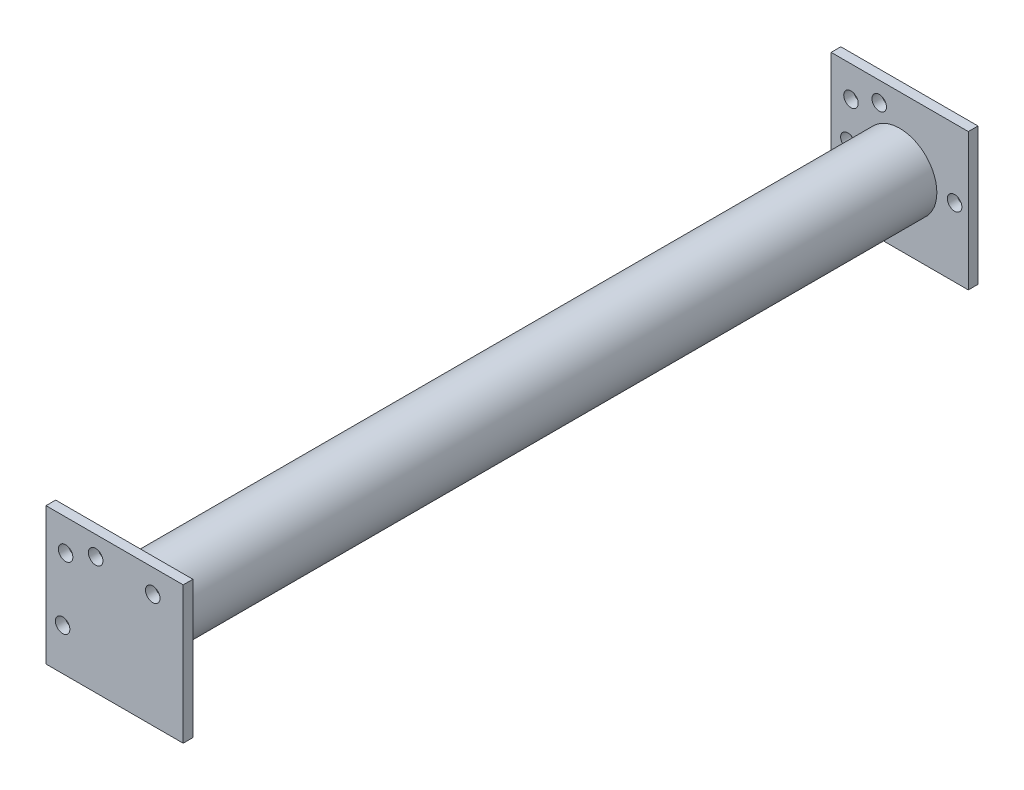
ISO-10303-21;
HEADER;
FILE_DESCRIPTION(('STEP AP214'),'2;1');
FILE_NAME('part.step','',(''),(''),'','','');
FILE_SCHEMA(('AUTOMOTIVE_DESIGN { 1 0 10303 214 1 1 1 1 }'));
ENDSEC;
DATA;
#1=APPLICATION_CONTEXT('core data for automotive mechanical design processes');
#2=APPLICATION_PROTOCOL_DEFINITION('international standard','automotive_design',2000,#1);
#3=PRODUCT_CONTEXT('',#1,'mechanical');
#4=PRODUCT('Part','Part','',(#3));
#5=PRODUCT_RELATED_PRODUCT_CATEGORY('part','',(#4));
#6=PRODUCT_DEFINITION_FORMATION('','',#4);
#7=PRODUCT_DEFINITION_CONTEXT('part definition',#1,'design');
#8=PRODUCT_DEFINITION('design','',#6,#7);
#9=PRODUCT_DEFINITION_SHAPE('','',#8);
#10=(LENGTH_UNIT() NAMED_UNIT(*) SI_UNIT(.MILLI.,.METRE.));
#11=(NAMED_UNIT(*) PLANE_ANGLE_UNIT() SI_UNIT($,.RADIAN.));
#12=(NAMED_UNIT(*) SI_UNIT($,.STERADIAN.) SOLID_ANGLE_UNIT());
#13=UNCERTAINTY_MEASURE_WITH_UNIT(LENGTH_MEASURE(1.E-05),#10,'distance_accuracy_value','');
#14=(GEOMETRIC_REPRESENTATION_CONTEXT(3) GLOBAL_UNCERTAINTY_ASSIGNED_CONTEXT((#13)) GLOBAL_UNIT_ASSIGNED_CONTEXT((#10,
#11,#12)) REPRESENTATION_CONTEXT('',''));
#15=CARTESIAN_POINT('',(0.,0.,0.));
#16=DIRECTION('',(0.,0.,1.));
#17=DIRECTION('',(1.,0.,0.));
#18=AXIS2_PLACEMENT_3D('',#15,#16,#17);
#19=CARTESIAN_POINT('',(0.,0.,961.));
#20=DIRECTION('',(0.,0.,-1.));
#21=DIRECTION('',(-1.,0.,0.));
#22=AXIS2_PLACEMENT_3D('',#19,#20,#21);
#23=CYLINDRICAL_SURFACE('',#22,46.);
#24=CARTESIAN_POINT('',(0.,0.,961.));
#25=DIRECTION('',(0.,0.,1.));
#26=DIRECTION('',(1.,0.,0.));
#27=AXIS2_PLACEMENT_3D('',#24,#25,#26);
#28=CIRCLE('',#27,46.);
#29=CARTESIAN_POINT('',(46.,0.,961.));
#30=VERTEX_POINT('',#29);
#31=EDGE_CURVE('E11',#30,#30,#28,.T.);
#32=ORIENTED_EDGE('',*,*,#31,.F.);
#33=EDGE_LOOP('',(#32));
#34=FACE_BOUND('',#33,.T.);
#35=CARTESIAN_POINT('',(0.,0.,0.));
#36=DIRECTION('',(0.,0.,1.));
#37=DIRECTION('',(1.,0.,0.));
#38=AXIS2_PLACEMENT_3D('',#35,#36,#37);
#39=CIRCLE('',#38,46.);
#40=CARTESIAN_POINT('',(46.,0.,0.));
#41=VERTEX_POINT('',#40);
#42=EDGE_CURVE('E45',#41,#41,#39,.T.);
#43=ORIENTED_EDGE('',*,*,#42,.T.);
#44=EDGE_LOOP('',(#43));
#45=FACE_BOUND('',#44,.T.);
#46=ADVANCED_FACE('F42',(#34,#45),#23,.T.);
#47=CARTESIAN_POINT('',(0.,0.,-12.));
#48=DIRECTION('',(0.,0.,-1.));
#49=DIRECTION('',(-1.,0.,0.));
#50=AXIS2_PLACEMENT_3D('',#47,#48,#49);
#51=PLANE('',#50);
#52=CARTESIAN_POINT('',(-60.4079697971354,46.8966168188544,-12.));
#53=DIRECTION('',(0.,0.,-1.));
#54=DIRECTION('',(-1.,0.,0.));
#55=AXIS2_PLACEMENT_3D('',#52,#53,#54);
#56=CIRCLE('',#55,9.);
#57=CARTESIAN_POINT('',(-69.4079697971354,46.8966168188544,-12.));
#58=VERTEX_POINT('',#57);
#59=EDGE_CURVE('E160',#58,#58,#56,.T.);
#60=ORIENTED_EDGE('',*,*,#59,.F.);
#61=EDGE_LOOP('',(#60));
#62=FACE_BOUND('',#61,.T.);
#63=CARTESIAN_POINT('',(-64.2275891692642,0.,-12.));
#64=DIRECTION('',(0.,0.,-1.));
#65=DIRECTION('',(-1.,0.,0.));
#66=AXIS2_PLACEMENT_3D('',#63,#64,#65);
#67=CIRCLE('',#66,9.);
#68=CARTESIAN_POINT('',(-73.2275891692642,0.,-12.));
#69=VERTEX_POINT('',#68);
#70=EDGE_CURVE('E172',#69,#69,#67,.T.);
#71=ORIENTED_EDGE('',*,*,#70,.F.);
#72=EDGE_LOOP('',(#71));
#73=FACE_BOUND('',#72,.T.);
#74=DIRECTION('',(0.,-1.,0.));
#75=VECTOR('',#74,1.);
#76=CARTESIAN_POINT('',(85.,85.,-12.));
#77=LINE('',#76,#75);
#78=CARTESIAN_POINT('',(85.,85.,-12.));
#79=VERTEX_POINT('',#78);
#80=CARTESIAN_POINT('',(85.,-85.,-12.));
#81=VERTEX_POINT('',#80);
#82=EDGE_CURVE('E178',#79,#81,#77,.T.);
#83=ORIENTED_EDGE('',*,*,#82,.T.);
#84=DIRECTION('',(-1.,0.,0.));
#85=VECTOR('',#84,1.);
#86=CARTESIAN_POINT('',(85.,-85.,-12.));
#87=LINE('',#86,#85);
#88=CARTESIAN_POINT('',(-85.,-85.,-12.));
#89=VERTEX_POINT('',#88);
#90=EDGE_CURVE('E92',#81,#89,#87,.T.);
#91=ORIENTED_EDGE('',*,*,#90,.T.);
#92=DIRECTION('',(0.,1.,0.));
#93=VECTOR('',#92,1.);
#94=CARTESIAN_POINT('',(-85.,85.,-12.));
#95=LINE('',#94,#93);
#96=CARTESIAN_POINT('',(-85.,85.,-12.));
#97=VERTEX_POINT('',#96);
#98=EDGE_CURVE('E181',#89,#97,#95,.T.);
#99=ORIENTED_EDGE('',*,*,#98,.T.);
#100=DIRECTION('',(1.,0.,0.));
#101=VECTOR('',#100,1.);
#102=CARTESIAN_POINT('',(85.,85.,-12.));
#103=LINE('',#102,#101);
#104=EDGE_CURVE('E60',#97,#79,#103,.T.);
#105=ORIENTED_EDGE('',*,*,#104,.T.);
#106=EDGE_LOOP('',(#83,#91,#99,#105));
#107=FACE_BOUND('',#106,.T.);
#108=CARTESIAN_POINT('',(68.0305385279705,0.,-12.));
#109=DIRECTION('',(0.,0.,-1.));
#110=DIRECTION('',(-1.,0.,0.));
#111=AXIS2_PLACEMENT_3D('',#108,#109,#110);
#112=CIRCLE('',#111,9.);
#113=CARTESIAN_POINT('',(59.0305385279705,0.,-12.));
#114=VERTEX_POINT('',#113);
#115=EDGE_CURVE('E166',#114,#114,#112,.T.);
#116=ORIENTED_EDGE('',*,*,#115,.F.);
#117=EDGE_LOOP('',(#116));
#118=FACE_BOUND('',#117,.T.);
#119=CARTESIAN_POINT('',(-25.4168158132703,60.6636282223423,-12.));
#120=DIRECTION('',(0.,0.,-1.));
#121=DIRECTION('',(-1.,0.,0.));
#122=AXIS2_PLACEMENT_3D('',#119,#120,#121);
#123=CIRCLE('',#122,9.);
#124=CARTESIAN_POINT('',(-34.4168158132703,60.6636282223423,-12.));
#125=VERTEX_POINT('',#124);
#126=EDGE_CURVE('E154',#125,#125,#123,.T.);
#127=ORIENTED_EDGE('',*,*,#126,.F.);
#128=EDGE_LOOP('',(#127));
#129=FACE_BOUND('',#128,.T.);
#130=ADVANCED_FACE('F209',(#62,#73,#107,#118,#129),#51,.T.);
#131=CARTESIAN_POINT('',(0.,0.,0.));
#132=DIRECTION('',(0.,0.,-1.));
#133=DIRECTION('',(-1.,0.,0.));
#134=AXIS2_PLACEMENT_3D('',#131,#132,#133);
#135=PLANE('',#134);
#136=ORIENTED_EDGE('',*,*,#42,.F.);
#137=EDGE_LOOP('',(#136));
#138=FACE_BOUND('',#137,.T.);
#139=DIRECTION('',(0.,-1.,0.));
#140=VECTOR('',#139,1.);
#141=CARTESIAN_POINT('',(85.,85.,0.));
#142=LINE('',#141,#140);
#143=CARTESIAN_POINT('',(85.,85.,0.));
#144=VERTEX_POINT('',#143);
#145=CARTESIAN_POINT('',(85.,-85.,0.));
#146=VERTEX_POINT('',#145);
#147=EDGE_CURVE('E175',#144,#146,#142,.T.);
#148=ORIENTED_EDGE('',*,*,#147,.F.);
#149=DIRECTION('',(1.,0.,0.));
#150=VECTOR('',#149,1.);
#151=CARTESIAN_POINT('',(85.,85.,0.));
#152=LINE('',#151,#150);
#153=CARTESIAN_POINT('',(-85.,85.,0.));
#154=VERTEX_POINT('',#153);
#155=EDGE_CURVE('E84',#154,#144,#152,.T.);
#156=ORIENTED_EDGE('',*,*,#155,.F.);
#157=DIRECTION('',(0.,1.,0.));
#158=VECTOR('',#157,1.);
#159=CARTESIAN_POINT('',(-85.,85.,0.));
#160=LINE('',#159,#158);
#161=CARTESIAN_POINT('',(-85.,-85.,0.));
#162=VERTEX_POINT('',#161);
#163=EDGE_CURVE('E78',#162,#154,#160,.T.);
#164=ORIENTED_EDGE('',*,*,#163,.F.);
#165=DIRECTION('',(-1.,0.,0.));
#166=VECTOR('',#165,1.);
#167=CARTESIAN_POINT('',(85.,-85.,0.));
#168=LINE('',#167,#166);
#169=EDGE_CURVE('E187',#146,#162,#168,.T.);
#170=ORIENTED_EDGE('',*,*,#169,.F.);
#171=EDGE_LOOP('',(#148,#156,#164,#170));
#172=FACE_BOUND('',#171,.T.);
#173=CARTESIAN_POINT('',(-64.2275891692642,0.,0.));
#174=DIRECTION('',(0.,0.,-1.));
#175=DIRECTION('',(-1.,0.,0.));
#176=AXIS2_PLACEMENT_3D('',#173,#174,#175);
#177=CIRCLE('',#176,9.);
#178=CARTESIAN_POINT('',(-73.2275891692642,0.,0.));
#179=VERTEX_POINT('',#178);
#180=EDGE_CURVE('E169',#179,#179,#177,.T.);
#181=ORIENTED_EDGE('',*,*,#180,.T.);
#182=EDGE_LOOP('',(#181));
#183=FACE_BOUND('',#182,.T.);
#184=CARTESIAN_POINT('',(68.0305385279705,0.,0.));
#185=DIRECTION('',(0.,0.,-1.));
#186=DIRECTION('',(-1.,0.,0.));
#187=AXIS2_PLACEMENT_3D('',#184,#185,#186);
#188=CIRCLE('',#187,9.);
#189=CARTESIAN_POINT('',(59.0305385279705,0.,0.));
#190=VERTEX_POINT('',#189);
#191=EDGE_CURVE('E163',#190,#190,#188,.T.);
#192=ORIENTED_EDGE('',*,*,#191,.T.);
#193=EDGE_LOOP('',(#192));
#194=FACE_BOUND('',#193,.T.);
#195=CARTESIAN_POINT('',(-60.4079697971354,46.8966168188544,0.));
#196=DIRECTION('',(0.,0.,-1.));
#197=DIRECTION('',(-1.,0.,0.));
#198=AXIS2_PLACEMENT_3D('',#195,#196,#197);
#199=CIRCLE('',#198,9.);
#200=CARTESIAN_POINT('',(-69.4079697971354,46.8966168188544,0.));
#201=VERTEX_POINT('',#200);
#202=EDGE_CURVE('E157',#201,#201,#199,.T.);
#203=ORIENTED_EDGE('',*,*,#202,.T.);
#204=EDGE_LOOP('',(#203));
#205=FACE_BOUND('',#204,.T.);
#206=CARTESIAN_POINT('',(-25.4168158132703,60.6636282223423,0.));
#207=DIRECTION('',(0.,0.,-1.));
#208=DIRECTION('',(-1.,0.,0.));
#209=AXIS2_PLACEMENT_3D('',#206,#207,#208);
#210=CIRCLE('',#209,9.);
#211=CARTESIAN_POINT('',(-34.4168158132703,60.6636282223423,0.));
#212=VERTEX_POINT('',#211);
#213=EDGE_CURVE('E148',#212,#212,#210,.T.);
#214=ORIENTED_EDGE('',*,*,#213,.T.);
#215=EDGE_LOOP('',(#214));
#216=FACE_BOUND('',#215,.T.);
#217=ADVANCED_FACE('F205',(#138,#172,#183,#194,#205,#216),#135,.F.);
#218=CARTESIAN_POINT('',(85.,85.,-12.));
#219=DIRECTION('',(-1.,0.,0.));
#220=DIRECTION('',(0.,-1.,0.));
#221=AXIS2_PLACEMENT_3D('',#218,#219,#220);
#222=PLANE('',#221);
#223=ORIENTED_EDGE('',*,*,#147,.T.);
#224=DIRECTION('',(0.,0.,1.));
#225=VECTOR('',#224,1.);
#226=CARTESIAN_POINT('',(85.,-85.,-12.));
#227=LINE('',#226,#225);
#228=EDGE_CURVE('E196',#81,#146,#227,.T.);
#229=ORIENTED_EDGE('',*,*,#228,.F.);
#230=ORIENTED_EDGE('',*,*,#82,.F.);
#231=DIRECTION('',(0.,0.,1.));
#232=VECTOR('',#231,1.);
#233=CARTESIAN_POINT('',(85.,85.,-12.));
#234=LINE('',#233,#232);
#235=EDGE_CURVE('E184',#79,#144,#234,.T.);
#236=ORIENTED_EDGE('',*,*,#235,.T.);
#237=EDGE_LOOP('',(#223,#229,#230,#236));
#238=FACE_BOUND('',#237,.T.);
#239=ADVANCED_FACE('F208',(#238),#222,.F.);
#240=CARTESIAN_POINT('',(85.,-85.,-12.));
#241=DIRECTION('',(0.,1.,0.));
#242=DIRECTION('',(-1.,0.,0.));
#243=AXIS2_PLACEMENT_3D('',#240,#241,#242);
#244=PLANE('',#243);
#245=ORIENTED_EDGE('',*,*,#169,.T.);
#246=DIRECTION('',(0.,0.,1.));
#247=VECTOR('',#246,1.);
#248=CARTESIAN_POINT('',(-85.,-85.,-12.));
#249=LINE('',#248,#247);
#250=EDGE_CURVE('E194',#89,#162,#249,.T.);
#251=ORIENTED_EDGE('',*,*,#250,.F.);
#252=ORIENTED_EDGE('',*,*,#90,.F.);
#253=ORIENTED_EDGE('',*,*,#228,.T.);
#254=EDGE_LOOP('',(#245,#251,#252,#253));
#255=FACE_BOUND('',#254,.T.);
#256=ADVANCED_FACE('F424',(#255),#244,.F.);
#257=CARTESIAN_POINT('',(-85.,85.,-12.));
#258=DIRECTION('',(1.,0.,0.));
#259=DIRECTION('',(0.,1.,0.));
#260=AXIS2_PLACEMENT_3D('',#257,#258,#259);
#261=PLANE('',#260);
#262=ORIENTED_EDGE('',*,*,#163,.T.);
#263=DIRECTION('',(0.,0.,1.));
#264=VECTOR('',#263,1.);
#265=CARTESIAN_POINT('',(-85.,85.,-12.));
#266=LINE('',#265,#264);
#267=EDGE_CURVE('E192',#97,#154,#266,.T.);
#268=ORIENTED_EDGE('',*,*,#267,.F.);
#269=ORIENTED_EDGE('',*,*,#98,.F.);
#270=ORIENTED_EDGE('',*,*,#250,.T.);
#271=EDGE_LOOP('',(#262,#268,#269,#270));
#272=FACE_BOUND('',#271,.T.);
#273=ADVANCED_FACE('F435',(#272),#261,.F.);
#274=CARTESIAN_POINT('',(85.,85.,-12.));
#275=DIRECTION('',(0.,-1.,0.));
#276=DIRECTION('',(0.,0.,-1.));
#277=AXIS2_PLACEMENT_3D('',#274,#275,#276);
#278=PLANE('',#277);
#279=ORIENTED_EDGE('',*,*,#155,.T.);
#280=ORIENTED_EDGE('',*,*,#235,.F.);
#281=ORIENTED_EDGE('',*,*,#104,.F.);
#282=ORIENTED_EDGE('',*,*,#267,.T.);
#283=EDGE_LOOP('',(#279,#280,#281,#282));
#284=FACE_BOUND('',#283,.T.);
#285=ADVANCED_FACE('F445',(#284),#278,.F.);
#286=CARTESIAN_POINT('',(-64.2275891692642,0.,-12.));
#287=DIRECTION('',(0.,0.,1.));
#288=DIRECTION('',(1.,0.,0.));
#289=AXIS2_PLACEMENT_3D('',#286,#287,#288);
#290=CYLINDRICAL_SURFACE('',#289,9.);
#291=ORIENTED_EDGE('',*,*,#70,.T.);
#292=EDGE_LOOP('',(#291));
#293=FACE_BOUND('',#292,.T.);
#294=ORIENTED_EDGE('',*,*,#180,.F.);
#295=EDGE_LOOP('',(#294));
#296=FACE_BOUND('',#295,.T.);
#297=ADVANCED_FACE('F455',(#293,#296),#290,.F.);
#298=CARTESIAN_POINT('',(68.0305385279705,0.,-12.));
#299=DIRECTION('',(0.,0.,1.));
#300=DIRECTION('',(1.,0.,0.));
#301=AXIS2_PLACEMENT_3D('',#298,#299,#300);
#302=CYLINDRICAL_SURFACE('',#301,9.);
#303=ORIENTED_EDGE('',*,*,#115,.T.);
#304=EDGE_LOOP('',(#303));
#305=FACE_BOUND('',#304,.T.);
#306=ORIENTED_EDGE('',*,*,#191,.F.);
#307=EDGE_LOOP('',(#306));
#308=FACE_BOUND('',#307,.T.);
#309=ADVANCED_FACE('F234',(#305,#308),#302,.F.);
#310=CARTESIAN_POINT('',(-60.4079697971354,46.8966168188544,-12.));
#311=DIRECTION('',(0.,0.,1.));
#312=DIRECTION('',(1.,0.,0.));
#313=AXIS2_PLACEMENT_3D('',#310,#311,#312);
#314=CYLINDRICAL_SURFACE('',#313,9.);
#315=ORIENTED_EDGE('',*,*,#59,.T.);
#316=EDGE_LOOP('',(#315));
#317=FACE_BOUND('',#316,.T.);
#318=ORIENTED_EDGE('',*,*,#202,.F.);
#319=EDGE_LOOP('',(#318));
#320=FACE_BOUND('',#319,.T.);
#321=ADVANCED_FACE('F224',(#317,#320),#314,.F.);
#322=CARTESIAN_POINT('',(-25.4168158132703,60.6636282223423,-12.));
#323=DIRECTION('',(0.,0.,1.));
#324=DIRECTION('',(1.,0.,0.));
#325=AXIS2_PLACEMENT_3D('',#322,#323,#324);
#326=CYLINDRICAL_SURFACE('',#325,9.);
#327=ORIENTED_EDGE('',*,*,#126,.T.);
#328=EDGE_LOOP('',(#327));
#329=FACE_BOUND('',#328,.T.);
#330=ORIENTED_EDGE('',*,*,#213,.F.);
#331=EDGE_LOOP('',(#330));
#332=FACE_BOUND('',#331,.T.);
#333=ADVANCED_FACE('F222',(#329,#332),#326,.F.);
#334=CARTESIAN_POINT('',(0.,0.,973.));
#335=DIRECTION('',(0.,0.,1.));
#336=DIRECTION('',(1.,0.,0.));
#337=AXIS2_PLACEMENT_3D('',#334,#335,#336);
#338=PLANE('',#337);
#339=CARTESIAN_POINT('',(-60.7164856170784,46.2261955116715,973.));
#340=DIRECTION('',(0.,0.,1.));
#341=DIRECTION('',(1.,0.,0.));
#342=AXIS2_PLACEMENT_3D('',#339,#340,#341);
#343=CIRCLE('',#342,9.);
#344=CARTESIAN_POINT('',(-51.7164856170784,46.2261955116715,973.));
#345=VERTEX_POINT('',#344);
#346=EDGE_CURVE('E274',#345,#345,#343,.T.);
#347=ORIENTED_EDGE('',*,*,#346,.F.);
#348=EDGE_LOOP('',(#347));
#349=FACE_BOUND('',#348,.T.);
#350=CARTESIAN_POINT('',(47.3067096525702,56.0603134071838,973.));
#351=DIRECTION('',(0.,0.,1.));
#352=DIRECTION('',(1.,0.,0.));
#353=AXIS2_PLACEMENT_3D('',#350,#351,#352);
#354=CIRCLE('',#353,9.);
#355=CARTESIAN_POINT('',(56.3067096525702,56.0603134071838,973.));
#356=VERTEX_POINT('',#355);
#357=EDGE_CURVE('E282',#356,#356,#354,.T.);
#358=ORIENTED_EDGE('',*,*,#357,.F.);
#359=EDGE_LOOP('',(#358));
#360=FACE_BOUND('',#359,.T.);
#361=DIRECTION('',(0.,-1.,0.));
#362=VECTOR('',#361,1.);
#363=CARTESIAN_POINT('',(-85.,85.,973.));
#364=LINE('',#363,#362);
#365=CARTESIAN_POINT('',(-85.,85.,973.));
#366=VERTEX_POINT('',#365);
#367=CARTESIAN_POINT('',(-85.,-85.,973.));
#368=VERTEX_POINT('',#367);
#369=EDGE_CURVE('E130',#366,#368,#364,.T.);
#370=ORIENTED_EDGE('',*,*,#369,.T.);
#371=DIRECTION('',(1.,0.,0.));
#372=VECTOR('',#371,1.);
#373=CARTESIAN_POINT('',(-85.,-85.,973.));
#374=LINE('',#373,#372);
#375=CARTESIAN_POINT('',(85.,-85.,973.));
#376=VERTEX_POINT('',#375);
#377=EDGE_CURVE('E119',#368,#376,#374,.T.);
#378=ORIENTED_EDGE('',*,*,#377,.T.);
#379=DIRECTION('',(0.,1.,0.));
#380=VECTOR('',#379,1.);
#381=CARTESIAN_POINT('',(85.,85.,973.));
#382=LINE('',#381,#380);
#383=CARTESIAN_POINT('',(85.,85.,973.));
#384=VERTEX_POINT('',#383);
#385=EDGE_CURVE('E129',#376,#384,#382,.T.);
#386=ORIENTED_EDGE('',*,*,#385,.T.);
#387=DIRECTION('',(-1.,0.,0.));
#388=VECTOR('',#387,1.);
#389=CARTESIAN_POINT('',(-85.,85.,973.));
#390=LINE('',#389,#388);
#391=EDGE_CURVE('E136',#384,#366,#390,.T.);
#392=ORIENTED_EDGE('',*,*,#391,.T.);
#393=EDGE_LOOP('',(#370,#378,#386,#392));
#394=FACE_BOUND('',#393,.T.);
#395=CARTESIAN_POINT('',(-23.4671079378892,60.9027325054784,973.));
#396=DIRECTION('',(0.,0.,1.));
#397=DIRECTION('',(1.,0.,0.));
#398=AXIS2_PLACEMENT_3D('',#395,#396,#397);
#399=CIRCLE('',#398,9.);
#400=CARTESIAN_POINT('',(-14.4671079378892,60.9027325054784,973.));
#401=VERTEX_POINT('',#400);
#402=EDGE_CURVE('E278',#401,#401,#399,.T.);
#403=ORIENTED_EDGE('',*,*,#402,.F.);
#404=EDGE_LOOP('',(#403));
#405=FACE_BOUND('',#404,.T.);
#406=CARTESIAN_POINT('',(-64.4414233849973,-32.9656992460783,973.));
#407=DIRECTION('',(0.,0.,1.));
#408=DIRECTION('',(1.,0.,0.));
#409=AXIS2_PLACEMENT_3D('',#406,#407,#408);
#410=CIRCLE('',#409,9.);
#411=CARTESIAN_POINT('',(-55.4414233849973,-32.9656992460783,973.));
#412=VERTEX_POINT('',#411);
#413=EDGE_CURVE('E269',#412,#412,#410,.T.);
#414=ORIENTED_EDGE('',*,*,#413,.F.);
#415=EDGE_LOOP('',(#414));
#416=FACE_BOUND('',#415,.T.);
#417=ADVANCED_FACE('F133',(#349,#360,#394,#405,#416),#338,.T.);
#418=CARTESIAN_POINT('',(0.,0.,961.));
#419=DIRECTION('',(0.,0.,1.));
#420=DIRECTION('',(1.,0.,0.));
#421=AXIS2_PLACEMENT_3D('',#418,#419,#420);
#422=PLANE('',#421);
#423=ORIENTED_EDGE('',*,*,#31,.T.);
#424=EDGE_LOOP('',(#423));
#425=FACE_BOUND('',#424,.T.);
#426=DIRECTION('',(0.,-1.,0.));
#427=VECTOR('',#426,1.);
#428=CARTESIAN_POINT('',(-85.,85.,961.));
#429=LINE('',#428,#427);
#430=CARTESIAN_POINT('',(-85.,85.,961.));
#431=VERTEX_POINT('',#430);
#432=CARTESIAN_POINT('',(-85.,-85.,961.));
#433=VERTEX_POINT('',#432);
#434=EDGE_CURVE('E144',#431,#433,#429,.T.);
#435=ORIENTED_EDGE('',*,*,#434,.F.);
#436=DIRECTION('',(-1.,0.,0.));
#437=VECTOR('',#436,1.);
#438=CARTESIAN_POINT('',(-85.,85.,961.));
#439=LINE('',#438,#437);
#440=CARTESIAN_POINT('',(85.,85.,961.));
#441=VERTEX_POINT('',#440);
#442=EDGE_CURVE('E140',#441,#431,#439,.T.);
#443=ORIENTED_EDGE('',*,*,#442,.F.);
#444=DIRECTION('',(0.,1.,0.));
#445=VECTOR('',#444,1.);
#446=CARTESIAN_POINT('',(85.,85.,961.));
#447=LINE('',#446,#445);
#448=CARTESIAN_POINT('',(85.,-85.,961.));
#449=VERTEX_POINT('',#448);
#450=EDGE_CURVE('E292',#449,#441,#447,.T.);
#451=ORIENTED_EDGE('',*,*,#450,.F.);
#452=DIRECTION('',(1.,0.,0.));
#453=VECTOR('',#452,1.);
#454=CARTESIAN_POINT('',(-85.,-85.,961.));
#455=LINE('',#454,#453);
#456=EDGE_CURVE('E290',#433,#449,#455,.T.);
#457=ORIENTED_EDGE('',*,*,#456,.F.);
#458=EDGE_LOOP('',(#435,#443,#451,#457));
#459=FACE_BOUND('',#458,.T.);
#460=CARTESIAN_POINT('',(47.3067096525702,56.0603134071838,961.));
#461=DIRECTION('',(0.,0.,1.));
#462=DIRECTION('',(1.,0.,0.));
#463=AXIS2_PLACEMENT_3D('',#460,#461,#462);
#464=CIRCLE('',#463,9.);
#465=CARTESIAN_POINT('',(56.3067096525702,56.0603134071838,961.));
#466=VERTEX_POINT('',#465);
#467=EDGE_CURVE('E256',#466,#466,#464,.T.);
#468=ORIENTED_EDGE('',*,*,#467,.T.);
#469=EDGE_LOOP('',(#468));
#470=FACE_BOUND('',#469,.T.);
#471=CARTESIAN_POINT('',(-23.4671079378892,60.9027325054784,961.));
#472=DIRECTION('',(0.,0.,1.));
#473=DIRECTION('',(1.,0.,0.));
#474=AXIS2_PLACEMENT_3D('',#471,#472,#473);
#475=CIRCLE('',#474,9.);
#476=CARTESIAN_POINT('',(-14.4671079378892,60.9027325054784,961.));
#477=VERTEX_POINT('',#476);
#478=EDGE_CURVE('E260',#477,#477,#475,.T.);
#479=ORIENTED_EDGE('',*,*,#478,.T.);
#480=EDGE_LOOP('',(#479));
#481=FACE_BOUND('',#480,.T.);
#482=CARTESIAN_POINT('',(-60.7164856170784,46.2261955116715,961.));
#483=DIRECTION('',(0.,0.,1.));
#484=DIRECTION('',(1.,0.,0.));
#485=AXIS2_PLACEMENT_3D('',#482,#483,#484);
#486=CIRCLE('',#485,9.);
#487=CARTESIAN_POINT('',(-51.7164856170784,46.2261955116715,961.));
#488=VERTEX_POINT('',#487);
#489=EDGE_CURVE('E264',#488,#488,#486,.T.);
#490=ORIENTED_EDGE('',*,*,#489,.T.);
#491=EDGE_LOOP('',(#490));
#492=FACE_BOUND('',#491,.T.);
#493=CARTESIAN_POINT('',(-64.4414233849973,-32.9656992460783,961.));
#494=DIRECTION('',(0.,0.,1.));
#495=DIRECTION('',(1.,0.,0.));
#496=AXIS2_PLACEMENT_3D('',#493,#494,#495);
#497=CIRCLE('',#496,9.);
#498=CARTESIAN_POINT('',(-55.4414233849973,-32.9656992460783,961.));
#499=VERTEX_POINT('',#498);
#500=EDGE_CURVE('E267',#499,#499,#497,.T.);
#501=ORIENTED_EDGE('',*,*,#500,.T.);
#502=EDGE_LOOP('',(#501));
#503=FACE_BOUND('',#502,.T.);
#504=ADVANCED_FACE('F231',(#425,#459,#470,#481,#492,#503),#422,.F.);
#505=CARTESIAN_POINT('',(-85.,85.,973.));
#506=DIRECTION('',(1.,0.,0.));
#507=DIRECTION('',(0.,1.,0.));
#508=AXIS2_PLACEMENT_3D('',#505,#506,#507);
#509=PLANE('',#508);
#510=ORIENTED_EDGE('',*,*,#434,.T.);
#511=DIRECTION('',(0.,0.,-1.));
#512=VECTOR('',#511,1.);
#513=CARTESIAN_POINT('',(-85.,-85.,973.));
#514=LINE('',#513,#512);
#515=EDGE_CURVE('E123',#368,#433,#514,.T.);
#516=ORIENTED_EDGE('',*,*,#515,.F.);
#517=ORIENTED_EDGE('',*,*,#369,.F.);
#518=DIRECTION('',(0.,0.,-1.));
#519=VECTOR('',#518,1.);
#520=CARTESIAN_POINT('',(-85.,85.,973.));
#521=LINE('',#520,#519);
#522=EDGE_CURVE('E288',#366,#431,#521,.T.);
#523=ORIENTED_EDGE('',*,*,#522,.T.);
#524=EDGE_LOOP('',(#510,#516,#517,#523));
#525=FACE_BOUND('',#524,.T.);
#526=ADVANCED_FACE('F142',(#525),#509,.F.);
#527=CARTESIAN_POINT('',(-85.,-85.,973.));
#528=DIRECTION('',(0.,1.,0.));
#529=DIRECTION('',(0.,0.,1.));
#530=AXIS2_PLACEMENT_3D('',#527,#528,#529);
#531=PLANE('',#530);
#532=ORIENTED_EDGE('',*,*,#456,.T.);
#533=DIRECTION('',(0.,0.,-1.));
#534=VECTOR('',#533,1.);
#535=CARTESIAN_POINT('',(85.,-85.,973.));
#536=LINE('',#535,#534);
#537=EDGE_CURVE('E126',#376,#449,#536,.T.);
#538=ORIENTED_EDGE('',*,*,#537,.F.);
#539=ORIENTED_EDGE('',*,*,#377,.F.);
#540=ORIENTED_EDGE('',*,*,#515,.T.);
#541=EDGE_LOOP('',(#532,#538,#539,#540));
#542=FACE_BOUND('',#541,.T.);
#543=ADVANCED_FACE('F121',(#542),#531,.F.);
#544=CARTESIAN_POINT('',(85.,85.,973.));
#545=DIRECTION('',(-1.,0.,0.));
#546=DIRECTION('',(0.,-1.,0.));
#547=AXIS2_PLACEMENT_3D('',#544,#545,#546);
#548=PLANE('',#547);
#549=ORIENTED_EDGE('',*,*,#450,.T.);
#550=DIRECTION('',(0.,0.,-1.));
#551=VECTOR('',#550,1.);
#552=CARTESIAN_POINT('',(85.,85.,973.));
#553=LINE('',#552,#551);
#554=EDGE_CURVE('E150',#384,#441,#553,.T.);
#555=ORIENTED_EDGE('',*,*,#554,.F.);
#556=ORIENTED_EDGE('',*,*,#385,.F.);
#557=ORIENTED_EDGE('',*,*,#537,.T.);
#558=EDGE_LOOP('',(#549,#555,#556,#557));
#559=FACE_BOUND('',#558,.T.);
#560=ADVANCED_FACE('F301',(#559),#548,.F.);
#561=CARTESIAN_POINT('',(-85.,85.,973.));
#562=DIRECTION('',(0.,-1.,0.));
#563=DIRECTION('',(0.,0.,-1.));
#564=AXIS2_PLACEMENT_3D('',#561,#562,#563);
#565=PLANE('',#564);
#566=ORIENTED_EDGE('',*,*,#442,.T.);
#567=ORIENTED_EDGE('',*,*,#522,.F.);
#568=ORIENTED_EDGE('',*,*,#391,.F.);
#569=ORIENTED_EDGE('',*,*,#554,.T.);
#570=EDGE_LOOP('',(#566,#567,#568,#569));
#571=FACE_BOUND('',#570,.T.);
#572=ADVANCED_FACE('F298',(#571),#565,.F.);
#573=CARTESIAN_POINT('',(47.3067096525702,56.0603134071838,973.));
#574=DIRECTION('',(0.,0.,-1.));
#575=DIRECTION('',(-1.,0.,0.));
#576=AXIS2_PLACEMENT_3D('',#573,#574,#575);
#577=CYLINDRICAL_SURFACE('',#576,9.);
#578=ORIENTED_EDGE('',*,*,#357,.T.);
#579=EDGE_LOOP('',(#578));
#580=FACE_BOUND('',#579,.T.);
#581=ORIENTED_EDGE('',*,*,#467,.F.);
#582=EDGE_LOOP('',(#581));
#583=FACE_BOUND('',#582,.T.);
#584=ADVANCED_FACE('F308',(#580,#583),#577,.F.);
#585=CARTESIAN_POINT('',(-23.4671079378892,60.9027325054784,973.));
#586=DIRECTION('',(0.,0.,-1.));
#587=DIRECTION('',(-1.,0.,0.));
#588=AXIS2_PLACEMENT_3D('',#585,#586,#587);
#589=CYLINDRICAL_SURFACE('',#588,9.);
#590=ORIENTED_EDGE('',*,*,#402,.T.);
#591=EDGE_LOOP('',(#590));
#592=FACE_BOUND('',#591,.T.);
#593=ORIENTED_EDGE('',*,*,#478,.F.);
#594=EDGE_LOOP('',(#593));
#595=FACE_BOUND('',#594,.T.);
#596=ADVANCED_FACE('F342',(#592,#595),#589,.F.);
#597=CARTESIAN_POINT('',(-60.7164856170784,46.2261955116715,973.));
#598=DIRECTION('',(0.,0.,-1.));
#599=DIRECTION('',(-1.,0.,0.));
#600=AXIS2_PLACEMENT_3D('',#597,#598,#599);
#601=CYLINDRICAL_SURFACE('',#600,9.);
#602=ORIENTED_EDGE('',*,*,#346,.T.);
#603=EDGE_LOOP('',(#602));
#604=FACE_BOUND('',#603,.T.);
#605=ORIENTED_EDGE('',*,*,#489,.F.);
#606=EDGE_LOOP('',(#605));
#607=FACE_BOUND('',#606,.T.);
#608=ADVANCED_FACE('F353',(#604,#607),#601,.F.);
#609=CARTESIAN_POINT('',(-64.4414233849973,-32.9656992460783,973.));
#610=DIRECTION('',(0.,0.,-1.));
#611=DIRECTION('',(-1.,0.,0.));
#612=AXIS2_PLACEMENT_3D('',#609,#610,#611);
#613=CYLINDRICAL_SURFACE('',#612,9.);
#614=ORIENTED_EDGE('',*,*,#413,.T.);
#615=EDGE_LOOP('',(#614));
#616=FACE_BOUND('',#615,.T.);
#617=ORIENTED_EDGE('',*,*,#500,.F.);
#618=EDGE_LOOP('',(#617));
#619=FACE_BOUND('',#618,.T.);
#620=ADVANCED_FACE('F364',(#616,#619),#613,.F.);
#621=CLOSED_SHELL('',(#46,#130,#217,#239,#256,#273,#285,#297,#309,#321,#333,#417,#504,#526,#543,
#560,#572,#584,#596,#608,#620));
#622=CARTESIAN_POINT('',(0.,0.,0.));
#623=DIRECTION('',(0.,0.,1.));
#624=DIRECTION('',(1.,0.,0.));
#625=AXIS2_PLACEMENT_3D('',#622,#623,#624);
#626=CIRCLE('',#625,40.);
#627=CARTESIAN_POINT('',(40.,0.,0.));
#628=VERTEX_POINT('',#627);
#629=EDGE_CURVE('E52',#628,#628,#626,.T.);
#630=ORIENTED_EDGE('',*,*,#629,.T.);
#631=EDGE_LOOP('',(#630));
#632=FACE_BOUND('',#631,.T.);
#633=ADVANCED_FACE('F211',(#632),#135,.F.);
#634=CARTESIAN_POINT('',(0.,0.,961.));
#635=DIRECTION('',(0.,0.,-1.));
#636=DIRECTION('',(-1.,0.,0.));
#637=AXIS2_PLACEMENT_3D('',#634,#635,#636);
#638=CYLINDRICAL_SURFACE('',#637,40.);
#639=CARTESIAN_POINT('',(0.,0.,961.));
#640=DIRECTION('',(0.,0.,1.));
#641=DIRECTION('',(1.,0.,0.));
#642=AXIS2_PLACEMENT_3D('',#639,#640,#641);
#643=CIRCLE('',#642,40.);
#644=CARTESIAN_POINT('',(40.,0.,961.));
#645=VERTEX_POINT('',#644);
#646=EDGE_CURVE('E145',#645,#645,#643,.T.);
#647=ORIENTED_EDGE('',*,*,#646,.T.);
#648=EDGE_LOOP('',(#647));
#649=FACE_BOUND('',#648,.T.);
#650=ORIENTED_EDGE('',*,*,#629,.F.);
#651=EDGE_LOOP('',(#650));
#652=FACE_BOUND('',#651,.T.);
#653=ADVANCED_FACE('F385',(#649,#652),#638,.F.);
#654=ORIENTED_EDGE('',*,*,#646,.F.);
#655=EDGE_LOOP('',(#654));
#656=FACE_BOUND('',#655,.T.);
#657=ADVANCED_FACE('F250',(#656),#422,.F.);
#658=CLOSED_SHELL('',(#633,#653,#657));
#659=ORIENTED_CLOSED_SHELL('',*,#658,.T.);
#660=BREP_WITH_VOIDS('B2',#621,(#659));
#661=ADVANCED_BREP_SHAPE_REPRESENTATION('',(#18,#660),#14);
#662=SHAPE_DEFINITION_REPRESENTATION(#9,#661);
ENDSEC;
END-ISO-10303-21;
